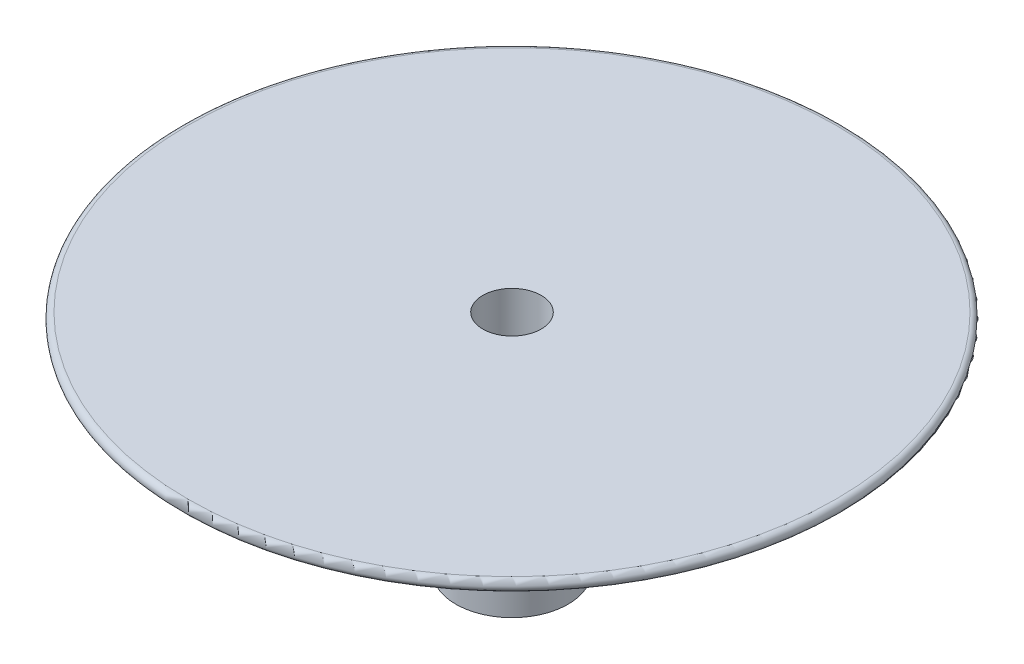
ISO-10303-21;
HEADER;
FILE_DESCRIPTION(('STEP AP214'),'2;1');
FILE_NAME('part.step','',(''),(''),'','','');
FILE_SCHEMA(('AUTOMOTIVE_DESIGN { 1 0 10303 214 1 1 1 1 }'));
ENDSEC;
DATA;
#1=APPLICATION_CONTEXT('core data for automotive mechanical design processes');
#2=APPLICATION_PROTOCOL_DEFINITION('international standard','automotive_design',2000,#1);
#3=PRODUCT_CONTEXT('',#1,'mechanical');
#4=PRODUCT('Part','Part','',(#3));
#5=PRODUCT_RELATED_PRODUCT_CATEGORY('part','',(#4));
#6=PRODUCT_DEFINITION_FORMATION('','',#4);
#7=PRODUCT_DEFINITION_CONTEXT('part definition',#1,'design');
#8=PRODUCT_DEFINITION('design','',#6,#7);
#9=PRODUCT_DEFINITION_SHAPE('','',#8);
#10=(LENGTH_UNIT() NAMED_UNIT(*) SI_UNIT(.MILLI.,.METRE.));
#11=(NAMED_UNIT(*) PLANE_ANGLE_UNIT() SI_UNIT($,.RADIAN.));
#12=(NAMED_UNIT(*) SI_UNIT($,.STERADIAN.) SOLID_ANGLE_UNIT());
#13=UNCERTAINTY_MEASURE_WITH_UNIT(LENGTH_MEASURE(1.E-05),#10,'distance_accuracy_value','');
#14=(GEOMETRIC_REPRESENTATION_CONTEXT(3) GLOBAL_UNCERTAINTY_ASSIGNED_CONTEXT((#13)) GLOBAL_UNIT_ASSIGNED_CONTEXT((#10,
#11,#12)) REPRESENTATION_CONTEXT('',''));
#15=CARTESIAN_POINT('',(0.,0.,0.));
#16=DIRECTION('',(0.,0.,1.));
#17=DIRECTION('',(1.,0.,0.));
#18=AXIS2_PLACEMENT_3D('',#15,#16,#17);
#19=CARTESIAN_POINT('',(0.,-10.,0.));
#20=DIRECTION('',(0.,1.,0.));
#21=DIRECTION('',(-1.,0.,0.));
#22=AXIS2_PLACEMENT_3D('',#19,#20,#21);
#23=PLANE('',#22);
#24=CARTESIAN_POINT('',(0.,-10.,0.));
#25=DIRECTION('',(0.,1.,0.));
#26=DIRECTION('',(-1.,0.,0.));
#27=AXIS2_PLACEMENT_3D('',#24,#25,#26);
#28=CIRCLE('',#27,2.6);
#29=CARTESIAN_POINT('',(-2.6,-10.,0.));
#30=VERTEX_POINT('',#29);
#31=EDGE_CURVE('E59',#30,#30,#28,.T.);
#32=ORIENTED_EDGE('',*,*,#31,.T.);
#33=EDGE_LOOP('',(#32));
#34=FACE_BOUND('',#33,.T.);
#35=CARTESIAN_POINT('',(0.,-10.,0.));
#36=DIRECTION('',(0.,1.,0.));
#37=DIRECTION('',(-1.,0.,0.));
#38=AXIS2_PLACEMENT_3D('',#35,#36,#37);
#39=CIRCLE('',#38,5.);
#40=CARTESIAN_POINT('',(-5.,-10.,0.));
#41=VERTEX_POINT('',#40);
#42=EDGE_CURVE('E50',#41,#41,#39,.T.);
#43=ORIENTED_EDGE('',*,*,#42,.F.);
#44=EDGE_LOOP('',(#43));
#45=FACE_BOUND('',#44,.T.);
#46=ADVANCED_FACE('F39',(#34,#45),#23,.F.);
#47=CARTESIAN_POINT('',(0.,10.,0.));
#48=DIRECTION('',(0.,1.,0.));
#49=DIRECTION('',(-1.,0.,0.));
#50=AXIS2_PLACEMENT_3D('',#47,#48,#49);
#51=CYLINDRICAL_SURFACE('',#50,5.);
#52=CARTESIAN_POINT('',(0.,0.,0.));
#53=DIRECTION('',(0.,1.,0.));
#54=DIRECTION('',(-1.,0.,0.));
#55=AXIS2_PLACEMENT_3D('',#52,#53,#54);
#56=CIRCLE('',#55,4.99999999999999);
#57=CARTESIAN_POINT('',(4.99999999999995,0.,0.));
#58=VERTEX_POINT('',#57);
#59=EDGE_CURVE('E54',#58,#58,#56,.T.);
#60=ORIENTED_EDGE('',*,*,#59,.F.);
#61=EDGE_LOOP('',(#60));
#62=FACE_BOUND('',#61,.T.);
#63=ORIENTED_EDGE('',*,*,#42,.T.);
#64=EDGE_LOOP('',(#63));
#65=FACE_BOUND('',#64,.T.);
#66=ADVANCED_FACE('F82',(#62,#65),#51,.T.);
#67=CARTESIAN_POINT('',(0.,49.749371855331,0.));
#68=DIRECTION('',(0.,1.,0.));
#69=DIRECTION('',(1.,0.,0.));
#70=AXIS2_PLACEMENT_3D('',#67,#68,#69);
#71=SPHERICAL_SURFACE('',#70,50.);
#72=CARTESIAN_POINT('',(0.,9.09344068832999,0.));
#73=DIRECTION('',(0.,1.,0.));
#74=DIRECTION('',(-1.,0.,0.));
#75=AXIS2_PLACEMENT_3D('',#72,#73,#74);
#76=CIRCLE('',#75,29.104900978084);
#77=CARTESIAN_POINT('',(29.104900978084,9.09344068832998,0.));
#78=VERTEX_POINT('',#77);
#79=EDGE_CURVE('E10',#78,#78,#76,.F.);
#80=CARTESIAN_POINT('',(29.104900978084,9.09344068832998,0.));
#81=CARTESIAN_POINT('',(28.8841990596875,8.93544361827802,0.));
#82=CARTESIAN_POINT('',(28.6622103685695,8.7792440200717,0.));
#83=CARTESIAN_POINT('',(28.2157188414584,8.4704804333429,0.));
#84=CARTESIAN_POINT('',(27.9912160054655,8.31791644482041,0.));
#85=CARTESIAN_POINT('',(27.5397555891729,8.0164647434518,0.));
#86=CARTESIAN_POINT('',(27.3127980088732,7.86757703060568,0.));
#87=CARTESIAN_POINT('',(26.8564883342355,7.57351731321825,0.));
#88=CARTESIAN_POINT('',(26.6271362398974,7.42834530867696,0.));
#89=CARTESIAN_POINT('',(26.1660983546384,7.14175552429449,0.));
#90=CARTESIAN_POINT('',(25.9344125637175,7.0003377444533,0.));
#91=CARTESIAN_POINT('',(25.4687687345068,6.72129391164086,0.));
#92=CARTESIAN_POINT('',(25.234810696217,6.5836678586696,0.));
#93=CARTESIAN_POINT('',(24.7646844206793,6.31224398111497,0.));
#94=CARTESIAN_POINT('',(24.5285161834313,6.17844615653161,0.));
#95=CARTESIAN_POINT('',(24.054032145486,5.9147142206361,0.));
#96=CARTESIAN_POINT('',(23.8157163447888,5.78478010932396,0.));
#97=CARTESIAN_POINT('',(23.3370003847731,5.5288100604971,0.));
#98=CARTESIAN_POINT('',(23.0966002254546,5.40277412298239,0.));
#99=CARTESIAN_POINT('',(22.6137793058931,5.15463384832753,0.));
#100=CARTESIAN_POINT('',(22.3713585456501,5.03252951118739,0.));
#101=CARTESIAN_POINT('',(21.8845607178121,4.7922848211658,0.));
#102=CARTESIAN_POINT('',(21.640183650217,4.67414446828434,0.));
#103=CARTESIAN_POINT('',(21.1495380200935,4.44185907935005,0.));
#104=CARTESIAN_POINT('',(20.9032694575651,4.32771404329721,0.));
#105=CARTESIAN_POINT('',(20.4089061516451,4.1034495609747,0.));
#106=CARTESIAN_POINT('',(20.1608114082535,3.99333011470503,0.));
#107=CARTESIAN_POINT('',(19.6628615390075,3.77714601725689,0.));
#108=CARTESIAN_POINT('',(19.4130064131531,3.67108136607842,0.));
#109=CARTESIAN_POINT('',(18.9116020442617,3.46303498872914,0.));
#110=CARTESIAN_POINT('',(18.6600528012246,3.36105326255833,0.));
#111=CARTESIAN_POINT('',(18.1553269125527,3.1611997822886,0.));
#112=CARTESIAN_POINT('',(17.9021502669179,3.06332802818968,0.));
#113=CARTESIAN_POINT('',(17.3942367192467,2.8717204491025,0.));
#114=CARTESIAN_POINT('',(17.1394998172104,2.77798462411423,0.));
#115=CARTESIAN_POINT('',(16.6285333167355,2.59467376337748,0.));
#116=CARTESIAN_POINT('',(16.372303718297,2.50509872762898,0.));
#117=CARTESIAN_POINT('',(15.8584197809023,2.33013320199797,0.));
#118=CARTESIAN_POINT('',(15.6007654419462,2.24474271211545,0.));
#119=CARTESIAN_POINT('',(15.0841003572631,2.07816892503897,0.));
#120=CARTESIAN_POINT('',(14.8250896115362,1.99698562784502,0.));
#121=CARTESIAN_POINT('',(14.3057804067975,1.83884775715864,0.));
#122=CARTESIAN_POINT('',(14.0454819477857,1.76189318366622,0.));
#123=CARTESIAN_POINT('',(13.5236663514841,1.61223316987509,0.));
#124=CARTESIAN_POINT('',(13.2621492141942,1.5395277295764,0.));
#125=CARTESIAN_POINT('',(12.7379656195542,1.39838526473409,0.));
#126=CARTESIAN_POINT('',(12.4752991622042,1.32994824019048,0.));
#127=CARTESIAN_POINT('',(11.9488865904794,1.19736075736435,0.));
#128=CARTESIAN_POINT('',(11.6851404761048,1.13321029908183,0.));
#129=CARTESIAN_POINT('',(11.156638539704,1.00921296245394,0.));
#130=CARTESIAN_POINT('',(10.8918827176779,0.94936608410858,0.));
#131=CARTESIAN_POINT('',(10.36143158315,0.833991779542488,0.));
#132=CARTESIAN_POINT('',(10.0957362706483,0.778464353321759,0.));
#133=CARTESIAN_POINT('',(9.56347662146174,0.671743680040644,0.));
#134=CARTESIAN_POINT('',(9.29691228477684,0.620550432980257,0.));
#135=CARTESIAN_POINT('',(8.76298528418243,0.522511693958788,0.));
#136=CARTESIAN_POINT('',(8.49562262027291,0.475666201997705,0.));
#137=CARTESIAN_POINT('',(7.96016987321388,0.386335402026848,0.));
#138=CARTESIAN_POINT('',(7.69207979006437,0.343850094017073,0.));
#139=CARTESIAN_POINT('',(7.15524330805277,0.263250912015351,0.));
#140=CARTESIAN_POINT('',(6.88649690919069,0.225137038023405,0.));
#141=CARTESIAN_POINT('',(6.34841906356646,0.153290898353169,0.));
#142=CARTESIAN_POINT('',(6.07908761680432,0.11955863267488,0.));
#143=CARTESIAN_POINT('',(5.53991113485358,0.0564844098670766,0.));
#144=CARTESIAN_POINT('',(5.27006609966498,0.027142452737562,0.));
#145=CARTESIAN_POINT('',(4.99999999999995,0.,0.));
#146=B_SPLINE_CURVE_WITH_KNOTS('',3,(#80,#81,#82,#83,#84,#85,#86,#87,#88,#89,#90,#91,#92,#93,
#94,#95,#96,#97,#98,#99,#100,#101,#102,#103,#104,#105,#106,#107,#108,#109,#110,#111,#112,#113,
#114,#115,#116,#117,#118,#119,#120,#121,#122,#123,#124,#125,#126,#127,#128,#129,#130,#131,#132,
#133,#134,#135,#136,#137,#138,#139,#140,#141,#142,#143,#144,#145),.UNSPECIFIED.,.F.,.F.,(4,2,2,
2,2,2,2,2,2,2,2,2,2,2,2,2,2,2,2,2,2,2,2,2,2,2,2,2,2,2,2,2,4),(0.,0.81427085645649,
1.62854171291298,2.44281256936947,3.25708342582597,4.07135428228246,4.88562513873894,
5.69989599519543,6.51416685165193,7.32843770810841,8.14270856456491,8.9569794210214,
9.7712502774779,10.5855211339344,11.3997919903909,12.2140628468474,13.0283337033039,
13.8426045597603,14.6568754162168,15.4711462726733,16.2854171291298,17.0996879855863,
17.9139588420428,18.7282296984993,19.5425005549558,20.3567714114123,21.1710422678688,
21.9853131243253,22.7995839807817,23.6138548372382,24.4281256936947,25.2423965501512,
26.0566674066077),.UNSPECIFIED.);
#147=EDGE_CURVE('BSEAM76',#78,#58,#146,.T.);
#148=ORIENTED_EDGE('',*,*,#79,.T.);
#149=ORIENTED_EDGE('',*,*,#59,.T.);
#150=ORIENTED_EDGE('',*,*,#147,.T.);
#151=ORIENTED_EDGE('',*,*,#147,.F.);
#152=EDGE_LOOP('',(#148,#150,#149,#151));
#153=FACE_BOUND('',#152,.T.);
#154=ADVANCED_FACE('F76',(#153),#71,.T.);
#155=CARTESIAN_POINT('',(0.,10.,0.));
#156=DIRECTION('',(0.,-1.,0.));
#157=DIRECTION('',(1.,0.,0.));
#158=AXIS2_PLACEMENT_3D('',#155,#156,#157);
#159=PLANE('',#158);
#160=CARTESIAN_POINT('',(0.,10.,0.));
#161=DIRECTION('',(0.,-1.,0.));
#162=DIRECTION('',(1.,0.,0.));
#163=AXIS2_PLACEMENT_3D('',#160,#161,#162);
#164=CIRCLE('',#163,28.8138519683032);
#165=CARTESIAN_POINT('',(28.8138519683032,10.,0.));
#166=VERTEX_POINT('',#165);
#167=EDGE_CURVE('E46',#166,#166,#164,.F.);
#168=ORIENTED_EDGE('',*,*,#167,.T.);
#169=EDGE_LOOP('',(#168));
#170=FACE_BOUND('',#169,.T.);
#171=CARTESIAN_POINT('',(0.,10.,0.));
#172=DIRECTION('',(0.,1.,0.));
#173=DIRECTION('',(-1.,0.,0.));
#174=AXIS2_PLACEMENT_3D('',#171,#172,#173);
#175=CIRCLE('',#174,2.6);
#176=CARTESIAN_POINT('',(-2.6,10.,0.));
#177=VERTEX_POINT('',#176);
#178=EDGE_CURVE('E60',#177,#177,#175,.T.);
#179=ORIENTED_EDGE('',*,*,#178,.F.);
#180=EDGE_LOOP('',(#179));
#181=FACE_BOUND('',#180,.T.);
#182=ADVANCED_FACE('F71',(#170,#181),#159,.F.);
#183=CARTESIAN_POINT('',(0.,-10.,0.));
#184=DIRECTION('',(0.,1.,0.));
#185=DIRECTION('',(-1.,0.,0.));
#186=AXIS2_PLACEMENT_3D('',#183,#184,#185);
#187=CYLINDRICAL_SURFACE('',#186,2.6);
#188=CARTESIAN_POINT('',(-2.6,-10.,0.));
#189=CARTESIAN_POINT('',(-2.6,-9.79166666666667,0.));
#190=CARTESIAN_POINT('',(-2.6,-9.58333333333334,0.));
#191=CARTESIAN_POINT('',(-2.6,-9.16666666666667,0.));
#192=CARTESIAN_POINT('',(-2.6,-8.95833333333334,0.));
#193=CARTESIAN_POINT('',(-2.6,-8.54166666666667,0.));
#194=CARTESIAN_POINT('',(-2.6,-8.33333333333334,0.));
#195=CARTESIAN_POINT('',(-2.6,-7.91666666666667,0.));
#196=CARTESIAN_POINT('',(-2.6,-7.70833333333334,0.));
#197=CARTESIAN_POINT('',(-2.6,-7.29166666666667,0.));
#198=CARTESIAN_POINT('',(-2.6,-7.08333333333333,0.));
#199=CARTESIAN_POINT('',(-2.6,-6.66666666666667,0.));
#200=CARTESIAN_POINT('',(-2.6,-6.45833333333333,0.));
#201=CARTESIAN_POINT('',(-2.6,-6.04166666666667,0.));
#202=CARTESIAN_POINT('',(-2.6,-5.83333333333333,0.));
#203=CARTESIAN_POINT('',(-2.6,-5.41666666666667,0.));
#204=CARTESIAN_POINT('',(-2.6,-5.20833333333333,0.));
#205=CARTESIAN_POINT('',(-2.6,-4.79166666666667,0.));
#206=CARTESIAN_POINT('',(-2.6,-4.58333333333333,0.));
#207=CARTESIAN_POINT('',(-2.6,-4.16666666666667,0.));
#208=CARTESIAN_POINT('',(-2.6,-3.95833333333333,0.));
#209=CARTESIAN_POINT('',(-2.6,-3.54166666666667,0.));
#210=CARTESIAN_POINT('',(-2.6,-3.33333333333333,0.));
#211=CARTESIAN_POINT('',(-2.6,-2.91666666666667,0.));
#212=CARTESIAN_POINT('',(-2.6,-2.70833333333333,0.));
#213=CARTESIAN_POINT('',(-2.6,-2.29166666666667,0.));
#214=CARTESIAN_POINT('',(-2.6,-2.08333333333333,0.));
#215=CARTESIAN_POINT('',(-2.6,-1.66666666666667,0.));
#216=CARTESIAN_POINT('',(-2.6,-1.45833333333333,0.));
#217=CARTESIAN_POINT('',(-2.6,-1.04166666666667,0.));
#218=CARTESIAN_POINT('',(-2.6,-0.833333333333332,0.));
#219=CARTESIAN_POINT('',(-2.6,-0.416666666666665,0.));
#220=CARTESIAN_POINT('',(-2.6,-0.208333333333332,0.));
#221=CARTESIAN_POINT('',(-2.6,0.208333333333335,0.));
#222=CARTESIAN_POINT('',(-2.6,0.416666666666669,0.));
#223=CARTESIAN_POINT('',(-2.6,0.833333333333336,0.));
#224=CARTESIAN_POINT('',(-2.6,1.04166666666667,0.));
#225=CARTESIAN_POINT('',(-2.6,1.45833333333334,0.));
#226=CARTESIAN_POINT('',(-2.6,1.66666666666667,0.));
#227=CARTESIAN_POINT('',(-2.6,2.08333333333334,0.));
#228=CARTESIAN_POINT('',(-2.6,2.29166666666667,0.));
#229=CARTESIAN_POINT('',(-2.6,2.70833333333334,0.));
#230=CARTESIAN_POINT('',(-2.6,2.91666666666667,0.));
#231=CARTESIAN_POINT('',(-2.6,3.33333333333334,0.));
#232=CARTESIAN_POINT('',(-2.6,3.54166666666667,0.));
#233=CARTESIAN_POINT('',(-2.6,3.95833333333334,0.));
#234=CARTESIAN_POINT('',(-2.6,4.16666666666667,0.));
#235=CARTESIAN_POINT('',(-2.6,4.58333333333334,0.));
#236=CARTESIAN_POINT('',(-2.6,4.79166666666667,0.));
#237=CARTESIAN_POINT('',(-2.6,5.20833333333334,0.));
#238=CARTESIAN_POINT('',(-2.6,5.41666666666667,0.));
#239=CARTESIAN_POINT('',(-2.6,5.83333333333333,0.));
#240=CARTESIAN_POINT('',(-2.6,6.04166666666667,0.));
#241=CARTESIAN_POINT('',(-2.6,6.45833333333333,0.));
#242=CARTESIAN_POINT('',(-2.6,6.66666666666667,0.));
#243=CARTESIAN_POINT('',(-2.6,7.08333333333333,0.));
#244=CARTESIAN_POINT('',(-2.6,7.29166666666667,0.));
#245=CARTESIAN_POINT('',(-2.6,7.70833333333334,0.));
#246=CARTESIAN_POINT('',(-2.6,7.91666666666667,0.));
#247=CARTESIAN_POINT('',(-2.6,8.33333333333334,0.));
#248=CARTESIAN_POINT('',(-2.6,8.54166666666667,0.));
#249=CARTESIAN_POINT('',(-2.6,8.95833333333334,0.));
#250=CARTESIAN_POINT('',(-2.6,9.16666666666667,0.));
#251=CARTESIAN_POINT('',(-2.6,9.58333333333334,0.));
#252=CARTESIAN_POINT('',(-2.6,9.79166666666667,0.));
#253=CARTESIAN_POINT('',(-2.6,10.,0.));
#254=B_SPLINE_CURVE_WITH_KNOTS('',3,(#188,#189,#190,#191,#192,#193,#194,#195,#196,#197,#198,
#199,#200,#201,#202,#203,#204,#205,#206,#207,#208,#209,#210,#211,#212,#213,#214,#215,#216,#217,
#218,#219,#220,#221,#222,#223,#224,#225,#226,#227,#228,#229,#230,#231,#232,#233,#234,#235,#236,
#237,#238,#239,#240,#241,#242,#243,#244,#245,#246,#247,#248,#249,#250,#251,#252,#253),
.UNSPECIFIED.,.F.,.F.,(4,2,2,2,2,2,2,2,2,2,2,2,2,2,2,2,2,2,2,2,2,2,2,2,2,2,2,2,2,2,2,2,4),(0.,
0.624999999999999,1.25,1.875,2.5,3.125,3.75,4.375,5.,5.625,6.25,6.875,7.5,8.125,8.75,9.375,10.,
10.625,11.25,11.875,12.5,13.125,13.75,14.375,15.,15.625,16.25,16.875,17.5,18.125,18.75,19.375,
20.),.UNSPECIFIED.);
#255=EDGE_CURVE('BSEAM68',#30,#177,#254,.T.);
#256=ORIENTED_EDGE('',*,*,#31,.F.);
#257=ORIENTED_EDGE('',*,*,#178,.T.);
#258=ORIENTED_EDGE('',*,*,#255,.T.);
#259=ORIENTED_EDGE('',*,*,#255,.F.);
#260=EDGE_LOOP('',(#256,#258,#257,#259));
#261=FACE_BOUND('',#260,.T.);
#262=ADVANCED_FACE('F68',(#261),#187,.F.);
#263=CARTESIAN_POINT('',(0.,9.5,0.));
#264=DIRECTION('',(0.,-1.,0.));
#265=DIRECTION('',(1.,0.,0.));
#266=AXIS2_PLACEMENT_3D('',#263,#264,#265);
#267=TOROIDAL_SURFACE('',#266,28.8138519683032,0.5);
#268=ORIENTED_EDGE('',*,*,#79,.F.);
#269=EDGE_LOOP('',(#268));
#270=FACE_BOUND('',#269,.T.);
#271=ORIENTED_EDGE('',*,*,#167,.F.);
#272=EDGE_LOOP('',(#271));
#273=FACE_BOUND('',#272,.T.);
#274=ADVANCED_FACE('F41',(#270,#273),#267,.T.);
#275=CLOSED_SHELL('',(#46,#66,#154,#182,#262,#274));
#276=MANIFOLD_SOLID_BREP('B2',#275);
#277=ADVANCED_BREP_SHAPE_REPRESENTATION('',(#18,#276),#14);
#278=SHAPE_DEFINITION_REPRESENTATION(#9,#277);
ENDSEC;
END-ISO-10303-21;
